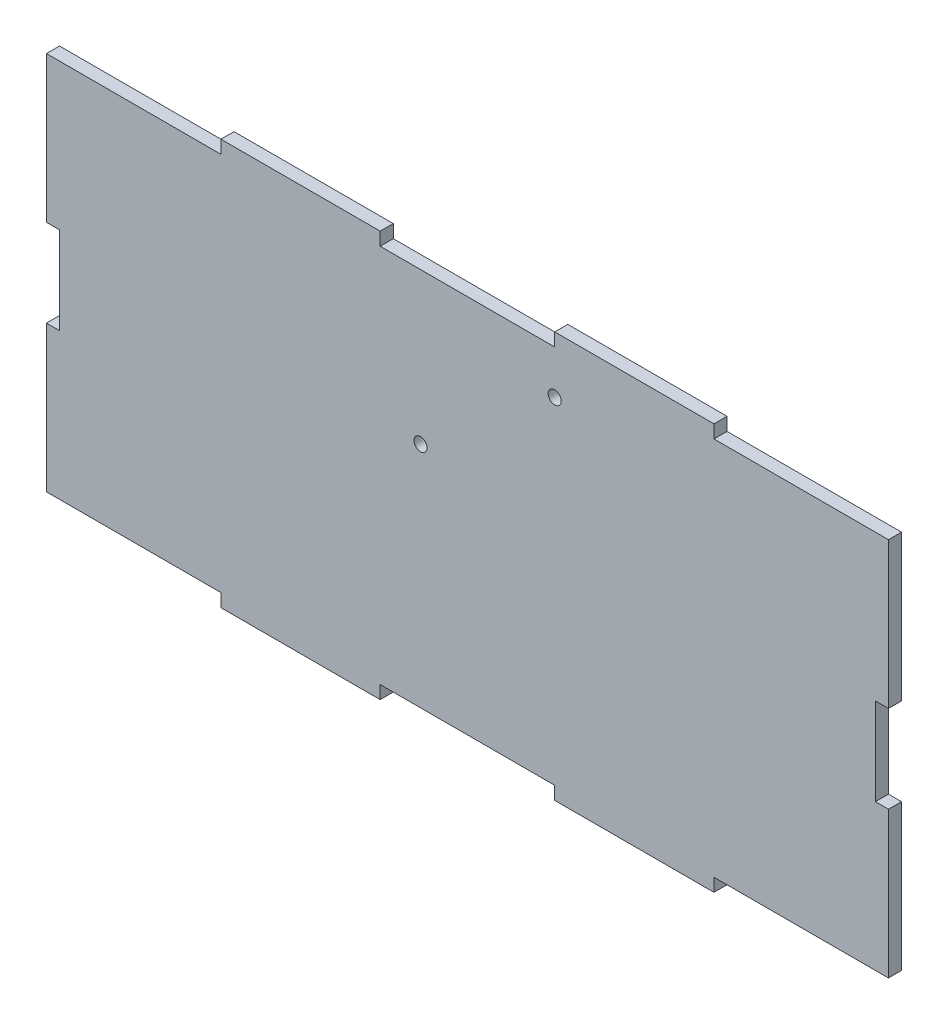
ISO-10303-21;
HEADER;
FILE_DESCRIPTION(('STEP AP214'),'2;1');
FILE_NAME('part.step','',(''),(''),'','','');
FILE_SCHEMA(('AUTOMOTIVE_DESIGN { 1 0 10303 214 1 1 1 1 }'));
ENDSEC;
DATA;
#1=APPLICATION_CONTEXT('core data for automotive mechanical design processes');
#2=APPLICATION_PROTOCOL_DEFINITION('international standard','automotive_design',2000,#1);
#3=PRODUCT_CONTEXT('',#1,'mechanical');
#4=PRODUCT('Part','Part','',(#3));
#5=PRODUCT_RELATED_PRODUCT_CATEGORY('part','',(#4));
#6=PRODUCT_DEFINITION_FORMATION('','',#4);
#7=PRODUCT_DEFINITION_CONTEXT('part definition',#1,'design');
#8=PRODUCT_DEFINITION('design','',#6,#7);
#9=PRODUCT_DEFINITION_SHAPE('','',#8);
#10=(LENGTH_UNIT() NAMED_UNIT(*) SI_UNIT(.MILLI.,.METRE.));
#11=(NAMED_UNIT(*) PLANE_ANGLE_UNIT() SI_UNIT($,.RADIAN.));
#12=(NAMED_UNIT(*) SI_UNIT($,.STERADIAN.) SOLID_ANGLE_UNIT());
#13=UNCERTAINTY_MEASURE_WITH_UNIT(LENGTH_MEASURE(1.E-05),#10,'distance_accuracy_value','');
#14=(GEOMETRIC_REPRESENTATION_CONTEXT(3) GLOBAL_UNCERTAINTY_ASSIGNED_CONTEXT((#13)) GLOBAL_UNIT_ASSIGNED_CONTEXT((#10,
#11,#12)) REPRESENTATION_CONTEXT('',''));
#15=CARTESIAN_POINT('',(0.,0.,0.));
#16=DIRECTION('',(0.,0.,1.));
#17=DIRECTION('',(1.,0.,0.));
#18=AXIS2_PLACEMENT_3D('',#15,#16,#17);
#19=CARTESIAN_POINT('',(96.5,46.5,3.));
#20=DIRECTION('',(-1.,0.,0.));
#21=DIRECTION('',(0.,-1.,0.));
#22=AXIS2_PLACEMENT_3D('',#19,#20,#21);
#23=PLANE('',#22);
#24=DIRECTION('',(0.,1.,0.));
#25=VECTOR('',#24,1.);
#26=CARTESIAN_POINT('',(96.5,46.5,0.));
#27=LINE('',#26,#25);
#28=CARTESIAN_POINT('',(96.5,-43.5,0.));
#29=VERTEX_POINT('',#28);
#30=CARTESIAN_POINT('',(96.5,-10.,0.));
#31=VERTEX_POINT('',#30);
#32=EDGE_CURVE('E257',#29,#31,#27,.T.);
#33=ORIENTED_EDGE('',*,*,#32,.T.);
#34=DIRECTION('',(0.,0.,-1.));
#35=VECTOR('',#34,1.);
#36=CARTESIAN_POINT('',(96.5,-10.,3.));
#37=LINE('',#36,#35);
#38=CARTESIAN_POINT('',(96.5,-10.,3.));
#39=VERTEX_POINT('',#38);
#40=EDGE_CURVE('E386',#39,#31,#37,.T.);
#41=ORIENTED_EDGE('',*,*,#40,.F.);
#42=DIRECTION('',(0.,1.,0.));
#43=VECTOR('',#42,1.);
#44=CARTESIAN_POINT('',(96.5,46.5,3.));
#45=LINE('',#44,#43);
#46=CARTESIAN_POINT('',(96.5,-43.5,3.));
#47=VERTEX_POINT('',#46);
#48=EDGE_CURVE('E368',#47,#39,#45,.T.);
#49=ORIENTED_EDGE('',*,*,#48,.F.);
#50=DIRECTION('',(0.,0.,-1.));
#51=VECTOR('',#50,1.);
#52=CARTESIAN_POINT('',(96.5,-43.5,3.));
#53=LINE('',#52,#51);
#54=EDGE_CURVE('E339',#47,#29,#53,.T.);
#55=ORIENTED_EDGE('',*,*,#54,.T.);
#56=EDGE_LOOP('',(#33,#41,#49,#55));
#57=FACE_BOUND('',#56,.T.);
#58=ADVANCED_FACE('F33',(#57),#23,.F.);
#59=CARTESIAN_POINT('',(-96.5,46.5,3.));
#60=DIRECTION('',(0.,-1.,0.));
#61=DIRECTION('',(0.,0.,-1.));
#62=AXIS2_PLACEMENT_3D('',#59,#60,#61);
#63=PLANE('',#62);
#64=DIRECTION('',(-1.,0.,0.));
#65=VECTOR('',#64,1.);
#66=CARTESIAN_POINT('',(-96.5,46.5,3.));
#67=LINE('',#66,#65);
#68=CARTESIAN_POINT('',(-20.,46.5,3.));
#69=VERTEX_POINT('',#68);
#70=CARTESIAN_POINT('',(-56.5,46.5,3.));
#71=VERTEX_POINT('',#70);
#72=EDGE_CURVE('E370',#69,#71,#67,.T.);
#73=ORIENTED_EDGE('',*,*,#72,.F.);
#74=DIRECTION('',(0.,0.,-1.));
#75=VECTOR('',#74,1.);
#76=CARTESIAN_POINT('',(-20.,46.5,3.));
#77=LINE('',#76,#75);
#78=CARTESIAN_POINT('',(-20.,46.5,0.));
#79=VERTEX_POINT('',#78);
#80=EDGE_CURVE('E306',#69,#79,#77,.T.);
#81=ORIENTED_EDGE('',*,*,#80,.T.);
#82=DIRECTION('',(-1.,0.,0.));
#83=VECTOR('',#82,1.);
#84=CARTESIAN_POINT('',(-96.5,46.5,0.));
#85=LINE('',#84,#83);
#86=CARTESIAN_POINT('',(-56.5,46.5,0.));
#87=VERTEX_POINT('',#86);
#88=EDGE_CURVE('E259',#79,#87,#85,.T.);
#89=ORIENTED_EDGE('',*,*,#88,.T.);
#90=DIRECTION('',(0.,0.,-1.));
#91=VECTOR('',#90,1.);
#92=CARTESIAN_POINT('',(-56.5,46.5,3.));
#93=LINE('',#92,#91);
#94=EDGE_CURVE('E58',#71,#87,#93,.T.);
#95=ORIENTED_EDGE('',*,*,#94,.F.);
#96=EDGE_LOOP('',(#73,#81,#89,#95));
#97=FACE_BOUND('',#96,.T.);
#98=ADVANCED_FACE('F457',(#97),#63,.F.);
#99=CARTESIAN_POINT('',(-96.5,46.5,3.));
#100=DIRECTION('',(1.,0.,0.));
#101=DIRECTION('',(0.,1.,0.));
#102=AXIS2_PLACEMENT_3D('',#99,#100,#101);
#103=PLANE('',#102);
#104=DIRECTION('',(0.,-1.,0.));
#105=VECTOR('',#104,1.);
#106=CARTESIAN_POINT('',(-96.5,46.5,3.));
#107=LINE('',#106,#105);
#108=CARTESIAN_POINT('',(-96.5,-10.,3.));
#109=VERTEX_POINT('',#108);
#110=CARTESIAN_POINT('',(-96.5,-43.5,3.));
#111=VERTEX_POINT('',#110);
#112=EDGE_CURVE('E250',#109,#111,#107,.T.);
#113=ORIENTED_EDGE('',*,*,#112,.F.);
#114=DIRECTION('',(0.,0.,-1.));
#115=VECTOR('',#114,1.);
#116=CARTESIAN_POINT('',(-96.5,-10.,3.));
#117=LINE('',#116,#115);
#118=CARTESIAN_POINT('',(-96.5,-10.,0.));
#119=VERTEX_POINT('',#118);
#120=EDGE_CURVE('E419',#109,#119,#117,.T.);
#121=ORIENTED_EDGE('',*,*,#120,.T.);
#122=DIRECTION('',(0.,-1.,0.));
#123=VECTOR('',#122,1.);
#124=CARTESIAN_POINT('',(-96.5,46.5,0.));
#125=LINE('',#124,#123);
#126=CARTESIAN_POINT('',(-96.5,-43.4999999999999,0.));
#127=VERTEX_POINT('',#126);
#128=EDGE_CURVE('E262',#119,#127,#125,.T.);
#129=ORIENTED_EDGE('',*,*,#128,.T.);
#130=DIRECTION('',(0.,0.,-1.));
#131=VECTOR('',#130,1.);
#132=CARTESIAN_POINT('',(-96.5,-43.5,3.));
#133=LINE('',#132,#131);
#134=EDGE_CURVE('E317',#111,#127,#133,.T.);
#135=ORIENTED_EDGE('',*,*,#134,.F.);
#136=EDGE_LOOP('',(#113,#121,#129,#135));
#137=FACE_BOUND('',#136,.T.);
#138=ADVANCED_FACE('F480',(#137),#103,.F.);
#139=CARTESIAN_POINT('',(-96.5,-46.5,3.));
#140=DIRECTION('',(0.,1.,0.));
#141=DIRECTION('',(0.,0.,1.));
#142=AXIS2_PLACEMENT_3D('',#139,#140,#141);
#143=PLANE('',#142);
#144=DIRECTION('',(1.,0.,0.));
#145=VECTOR('',#144,1.);
#146=CARTESIAN_POINT('',(-96.5,-46.5,0.));
#147=LINE('',#146,#145);
#148=CARTESIAN_POINT('',(20.,-46.5,0.));
#149=VERTEX_POINT('',#148);
#150=CARTESIAN_POINT('',(56.5,-46.5,0.));
#151=VERTEX_POINT('',#150);
#152=EDGE_CURVE('E37',#149,#151,#147,.T.);
#153=ORIENTED_EDGE('',*,*,#152,.T.);
#154=DIRECTION('',(0.,0.,-1.));
#155=VECTOR('',#154,1.);
#156=CARTESIAN_POINT('',(56.5,-46.5,3.));
#157=LINE('',#156,#155);
#158=CARTESIAN_POINT('',(56.5,-46.5,3.));
#159=VERTEX_POINT('',#158);
#160=EDGE_CURVE('E224',#159,#151,#157,.T.);
#161=ORIENTED_EDGE('',*,*,#160,.F.);
#162=DIRECTION('',(1.,0.,0.));
#163=VECTOR('',#162,1.);
#164=CARTESIAN_POINT('',(-96.5,-46.5,3.));
#165=LINE('',#164,#163);
#166=CARTESIAN_POINT('',(20.,-46.5,3.));
#167=VERTEX_POINT('',#166);
#168=EDGE_CURVE('E42',#167,#159,#165,.T.);
#169=ORIENTED_EDGE('',*,*,#168,.F.);
#170=DIRECTION('',(0.,0.,-1.));
#171=VECTOR('',#170,1.);
#172=CARTESIAN_POINT('',(20.,-46.5,3.));
#173=LINE('',#172,#171);
#174=EDGE_CURVE('E335',#167,#149,#173,.T.);
#175=ORIENTED_EDGE('',*,*,#174,.T.);
#176=EDGE_LOOP('',(#153,#161,#169,#175));
#177=FACE_BOUND('',#176,.T.);
#178=ADVANCED_FACE('F237',(#177),#143,.F.);
#179=CARTESIAN_POINT('',(96.5,10.,3.));
#180=VERTEX_POINT('',#179);
#181=CARTESIAN_POINT('',(96.5,43.5,3.));
#182=VERTEX_POINT('',#181);
#183=EDGE_CURVE('E366',#180,#182,#45,.T.);
#184=ORIENTED_EDGE('',*,*,#183,.F.);
#185=DIRECTION('',(0.,0.,-1.));
#186=VECTOR('',#185,1.);
#187=CARTESIAN_POINT('',(96.5,10.,3.));
#188=LINE('',#187,#186);
#189=CARTESIAN_POINT('',(96.5,10.,0.));
#190=VERTEX_POINT('',#189);
#191=EDGE_CURVE('E391',#180,#190,#188,.T.);
#192=ORIENTED_EDGE('',*,*,#191,.T.);
#193=CARTESIAN_POINT('',(96.5,43.5,0.));
#194=VERTEX_POINT('',#193);
#195=EDGE_CURVE('E254',#190,#194,#27,.T.);
#196=ORIENTED_EDGE('',*,*,#195,.T.);
#197=DIRECTION('',(0.,0.,-1.));
#198=VECTOR('',#197,1.);
#199=CARTESIAN_POINT('',(96.5,43.5,3.));
#200=LINE('',#199,#198);
#201=EDGE_CURVE('E356',#182,#194,#200,.T.);
#202=ORIENTED_EDGE('',*,*,#201,.F.);
#203=EDGE_LOOP('',(#184,#192,#196,#202));
#204=FACE_BOUND('',#203,.T.);
#205=ADVANCED_FACE('F35',(#204),#23,.F.);
#206=CARTESIAN_POINT('',(56.5,46.5,0.));
#207=VERTEX_POINT('',#206);
#208=CARTESIAN_POINT('',(20.,46.5,0.));
#209=VERTEX_POINT('',#208);
#210=EDGE_CURVE('E261',#207,#209,#85,.T.);
#211=ORIENTED_EDGE('',*,*,#210,.T.);
#212=DIRECTION('',(0.,0.,-1.));
#213=VECTOR('',#212,1.);
#214=CARTESIAN_POINT('',(20.,46.5,3.));
#215=LINE('',#214,#213);
#216=CARTESIAN_POINT('',(20.,46.5,3.));
#217=VERTEX_POINT('',#216);
#218=EDGE_CURVE('E277',#217,#209,#215,.T.);
#219=ORIENTED_EDGE('',*,*,#218,.F.);
#220=CARTESIAN_POINT('',(56.5,46.5,3.));
#221=VERTEX_POINT('',#220);
#222=EDGE_CURVE('E372',#221,#217,#67,.T.);
#223=ORIENTED_EDGE('',*,*,#222,.F.);
#224=DIRECTION('',(0.,0.,-1.));
#225=VECTOR('',#224,1.);
#226=CARTESIAN_POINT('',(56.5,46.5,3.));
#227=LINE('',#226,#225);
#228=EDGE_CURVE('E258',#221,#207,#227,.T.);
#229=ORIENTED_EDGE('',*,*,#228,.T.);
#230=EDGE_LOOP('',(#211,#219,#223,#229));
#231=FACE_BOUND('',#230,.T.);
#232=ADVANCED_FACE('F275',(#231),#63,.F.);
#233=CARTESIAN_POINT('',(-96.5,43.5,0.));
#234=VERTEX_POINT('',#233);
#235=CARTESIAN_POINT('',(-96.5,10.,0.));
#236=VERTEX_POINT('',#235);
#237=EDGE_CURVE('E264',#234,#236,#125,.T.);
#238=ORIENTED_EDGE('',*,*,#237,.T.);
#239=DIRECTION('',(0.,0.,-1.));
#240=VECTOR('',#239,1.);
#241=CARTESIAN_POINT('',(-96.5,10.,3.));
#242=LINE('',#241,#240);
#243=CARTESIAN_POINT('',(-96.5,10.,3.));
#244=VERTEX_POINT('',#243);
#245=EDGE_CURVE('E410',#244,#236,#242,.T.);
#246=ORIENTED_EDGE('',*,*,#245,.F.);
#247=CARTESIAN_POINT('',(-96.5,43.5,3.));
#248=VERTEX_POINT('',#247);
#249=EDGE_CURVE('E248',#248,#244,#107,.T.);
#250=ORIENTED_EDGE('',*,*,#249,.F.);
#251=DIRECTION('',(0.,0.,-1.));
#252=VECTOR('',#251,1.);
#253=CARTESIAN_POINT('',(-96.5,43.5,3.));
#254=LINE('',#253,#252);
#255=EDGE_CURVE('E360',#248,#234,#254,.T.);
#256=ORIENTED_EDGE('',*,*,#255,.T.);
#257=EDGE_LOOP('',(#238,#246,#250,#256));
#258=FACE_BOUND('',#257,.T.);
#259=ADVANCED_FACE('F467',(#258),#103,.F.);
#260=CARTESIAN_POINT('',(-56.5,-46.5,0.));
#261=VERTEX_POINT('',#260);
#262=CARTESIAN_POINT('',(-20.,-46.5,0.));
#263=VERTEX_POINT('',#262);
#264=EDGE_CURVE('E369',#261,#263,#147,.T.);
#265=ORIENTED_EDGE('',*,*,#264,.T.);
#266=DIRECTION('',(0.,0.,-1.));
#267=VECTOR('',#266,1.);
#268=CARTESIAN_POINT('',(-20.,-46.5,3.));
#269=LINE('',#268,#267);
#270=CARTESIAN_POINT('',(-20.,-46.5,3.));
#271=VERTEX_POINT('',#270);
#272=EDGE_CURVE('E347',#271,#263,#269,.T.);
#273=ORIENTED_EDGE('',*,*,#272,.F.);
#274=CARTESIAN_POINT('',(-56.5,-46.5,3.));
#275=VERTEX_POINT('',#274);
#276=EDGE_CURVE('E11',#275,#271,#165,.T.);
#277=ORIENTED_EDGE('',*,*,#276,.F.);
#278=DIRECTION('',(0.,0.,-1.));
#279=VECTOR('',#278,1.);
#280=CARTESIAN_POINT('',(-56.5,-46.5,3.));
#281=LINE('',#280,#279);
#282=EDGE_CURVE('E296',#275,#261,#281,.T.);
#283=ORIENTED_EDGE('',*,*,#282,.T.);
#284=EDGE_LOOP('',(#265,#273,#277,#283));
#285=FACE_BOUND('',#284,.T.);
#286=ADVANCED_FACE('F493',(#285),#143,.F.);
#287=CARTESIAN_POINT('',(0.,0.,3.));
#288=DIRECTION('',(0.,0.,1.));
#289=DIRECTION('',(1.,0.,0.));
#290=AXIS2_PLACEMENT_3D('',#287,#288,#289);
#291=PLANE('',#290);
#292=CARTESIAN_POINT('',(20.,33.5,3.));
#293=DIRECTION('',(0.,0.,-1.));
#294=DIRECTION('',(-1.,0.,0.));
#295=AXIS2_PLACEMENT_3D('',#292,#293,#294);
#296=CIRCLE('',#295,1.5);
#297=CARTESIAN_POINT('',(18.5,33.5,3.));
#298=VERTEX_POINT('',#297);
#299=EDGE_CURVE('E415',#298,#298,#296,.T.);
#300=ORIENTED_EDGE('',*,*,#299,.T.);
#301=EDGE_LOOP('',(#300));
#302=FACE_BOUND('',#301,.T.);
#303=DIRECTION('',(-1.,0.,0.));
#304=VECTOR('',#303,1.);
#305=CARTESIAN_POINT('',(-96.5,-10.,3.));
#306=LINE('',#305,#304);
#307=CARTESIAN_POINT('',(-93.5,-10.,3.));
#308=VERTEX_POINT('',#307);
#309=EDGE_CURVE('E408',#308,#109,#306,.T.);
#310=ORIENTED_EDGE('',*,*,#309,.T.);
#311=ORIENTED_EDGE('',*,*,#112,.T.);
#312=DIRECTION('',(1.,0.,0.));
#313=VECTOR('',#312,1.);
#314=CARTESIAN_POINT('',(-96.5,-43.5,3.));
#315=LINE('',#314,#313);
#316=CARTESIAN_POINT('',(-56.5,-43.5,3.));
#317=VERTEX_POINT('',#316);
#318=EDGE_CURVE('E310',#111,#317,#315,.T.);
#319=ORIENTED_EDGE('',*,*,#318,.T.);
#320=DIRECTION('',(0.,-1.,0.));
#321=VECTOR('',#320,1.);
#322=CARTESIAN_POINT('',(-56.5,-46.5,3.));
#323=LINE('',#322,#321);
#324=EDGE_CURVE('E313',#317,#275,#323,.T.);
#325=ORIENTED_EDGE('',*,*,#324,.T.);
#326=ORIENTED_EDGE('',*,*,#276,.T.);
#327=DIRECTION('',(0.,1.,0.));
#328=VECTOR('',#327,1.);
#329=CARTESIAN_POINT('',(-20.,-46.5,3.));
#330=LINE('',#329,#328);
#331=CARTESIAN_POINT('',(-20.,-43.5,3.));
#332=VERTEX_POINT('',#331);
#333=EDGE_CURVE('E329',#271,#332,#330,.T.);
#334=ORIENTED_EDGE('',*,*,#333,.T.);
#335=DIRECTION('',(1.,0.,0.));
#336=VECTOR('',#335,1.);
#337=CARTESIAN_POINT('',(20.,-43.5,3.));
#338=LINE('',#337,#336);
#339=CARTESIAN_POINT('',(20.,-43.5,3.));
#340=VERTEX_POINT('',#339);
#341=EDGE_CURVE('E333',#332,#340,#338,.T.);
#342=ORIENTED_EDGE('',*,*,#341,.T.);
#343=DIRECTION('',(0.,-1.,0.));
#344=VECTOR('',#343,1.);
#345=CARTESIAN_POINT('',(20.,-46.5,3.));
#346=LINE('',#345,#344);
#347=EDGE_CURVE('E247',#340,#167,#346,.T.);
#348=ORIENTED_EDGE('',*,*,#347,.T.);
#349=ORIENTED_EDGE('',*,*,#168,.T.);
#350=DIRECTION('',(0.,1.,0.));
#351=VECTOR('',#350,1.);
#352=CARTESIAN_POINT('',(56.5,-46.5,3.));
#353=LINE('',#352,#351);
#354=CARTESIAN_POINT('',(56.5,-43.5,3.));
#355=VERTEX_POINT('',#354);
#356=EDGE_CURVE('E220',#159,#355,#353,.T.);
#357=ORIENTED_EDGE('',*,*,#356,.T.);
#358=DIRECTION('',(1.,0.,0.));
#359=VECTOR('',#358,1.);
#360=CARTESIAN_POINT('',(96.5,-43.5,3.));
#361=LINE('',#360,#359);
#362=EDGE_CURVE('E231',#355,#47,#361,.T.);
#363=ORIENTED_EDGE('',*,*,#362,.T.);
#364=ORIENTED_EDGE('',*,*,#48,.T.);
#365=DIRECTION('',(-1.,0.,0.));
#366=VECTOR('',#365,1.);
#367=CARTESIAN_POINT('',(96.5,-10.,3.));
#368=LINE('',#367,#366);
#369=CARTESIAN_POINT('',(93.5,-10.,3.));
#370=VERTEX_POINT('',#369);
#371=EDGE_CURVE('E380',#39,#370,#368,.T.);
#372=ORIENTED_EDGE('',*,*,#371,.T.);
#373=DIRECTION('',(0.,1.,0.));
#374=VECTOR('',#373,1.);
#375=CARTESIAN_POINT('',(93.5,10.,3.));
#376=LINE('',#375,#374);
#377=CARTESIAN_POINT('',(93.5,10.,3.));
#378=VERTEX_POINT('',#377);
#379=EDGE_CURVE('E511',#370,#378,#376,.T.);
#380=ORIENTED_EDGE('',*,*,#379,.T.);
#381=DIRECTION('',(1.,0.,0.));
#382=VECTOR('',#381,1.);
#383=CARTESIAN_POINT('',(96.5,10.,3.));
#384=LINE('',#383,#382);
#385=EDGE_CURVE('E513',#378,#180,#384,.T.);
#386=ORIENTED_EDGE('',*,*,#385,.T.);
#387=ORIENTED_EDGE('',*,*,#183,.T.);
#388=DIRECTION('',(-1.,0.,0.));
#389=VECTOR('',#388,1.);
#390=CARTESIAN_POINT('',(96.5,43.5,3.));
#391=LINE('',#390,#389);
#392=CARTESIAN_POINT('',(56.5,43.5,3.));
#393=VERTEX_POINT('',#392);
#394=EDGE_CURVE('E350',#182,#393,#391,.T.);
#395=ORIENTED_EDGE('',*,*,#394,.T.);
#396=DIRECTION('',(0.,1.,0.));
#397=VECTOR('',#396,1.);
#398=CARTESIAN_POINT('',(56.5,46.5,3.));
#399=LINE('',#398,#397);
#400=EDGE_CURVE('E353',#393,#221,#399,.T.);
#401=ORIENTED_EDGE('',*,*,#400,.T.);
#402=ORIENTED_EDGE('',*,*,#222,.T.);
#403=DIRECTION('',(0.,-1.,0.));
#404=VECTOR('',#403,1.);
#405=CARTESIAN_POINT('',(20.,46.5,3.));
#406=LINE('',#405,#404);
#407=CARTESIAN_POINT('',(20.,43.5,3.));
#408=VERTEX_POINT('',#407);
#409=EDGE_CURVE('E446',#217,#408,#406,.T.);
#410=ORIENTED_EDGE('',*,*,#409,.T.);
#411=DIRECTION('',(-1.,0.,0.));
#412=VECTOR('',#411,1.);
#413=CARTESIAN_POINT('',(20.,43.5,3.));
#414=LINE('',#413,#412);
#415=CARTESIAN_POINT('',(-20.,43.5,3.));
#416=VERTEX_POINT('',#415);
#417=EDGE_CURVE('E309',#408,#416,#414,.T.);
#418=ORIENTED_EDGE('',*,*,#417,.T.);
#419=DIRECTION('',(0.,1.,0.));
#420=VECTOR('',#419,1.);
#421=CARTESIAN_POINT('',(-20.,46.5,3.));
#422=LINE('',#421,#420);
#423=EDGE_CURVE('E294',#416,#69,#422,.T.);
#424=ORIENTED_EDGE('',*,*,#423,.T.);
#425=ORIENTED_EDGE('',*,*,#72,.T.);
#426=DIRECTION('',(0.,-1.,0.));
#427=VECTOR('',#426,1.);
#428=CARTESIAN_POINT('',(-56.5,46.5,3.));
#429=LINE('',#428,#427);
#430=CARTESIAN_POINT('',(-56.5,43.5,3.));
#431=VERTEX_POINT('',#430);
#432=EDGE_CURVE('E432',#71,#431,#429,.T.);
#433=ORIENTED_EDGE('',*,*,#432,.T.);
#434=DIRECTION('',(-1.,0.,0.));
#435=VECTOR('',#434,1.);
#436=CARTESIAN_POINT('',(-96.5,43.5,3.));
#437=LINE('',#436,#435);
#438=EDGE_CURVE('E434',#431,#248,#437,.T.);
#439=ORIENTED_EDGE('',*,*,#438,.T.);
#440=ORIENTED_EDGE('',*,*,#249,.T.);
#441=DIRECTION('',(1.,0.,0.));
#442=VECTOR('',#441,1.);
#443=CARTESIAN_POINT('',(-96.5,10.,3.));
#444=LINE('',#443,#442);
#445=CARTESIAN_POINT('',(-93.5,10.,3.));
#446=VERTEX_POINT('',#445);
#447=EDGE_CURVE('E401',#244,#446,#444,.T.);
#448=ORIENTED_EDGE('',*,*,#447,.T.);
#449=DIRECTION('',(0.,-1.,0.));
#450=VECTOR('',#449,1.);
#451=CARTESIAN_POINT('',(-93.5,10.,3.));
#452=LINE('',#451,#450);
#453=EDGE_CURVE('E404',#446,#308,#452,.T.);
#454=ORIENTED_EDGE('',*,*,#453,.T.);
#455=EDGE_LOOP('',(#310,#311,#319,#325,#326,#334,#342,#348,#349,#357,#363,#364,#372,#380,#386,
#387,#395,#401,#402,#410,#418,#424,#425,#433,#439,#440,#448,#454));
#456=FACE_BOUND('',#455,.T.);
#457=CARTESIAN_POINT('',(-10.759,8.83699999999999,3.));
#458=DIRECTION('',(0.,0.,-1.));
#459=DIRECTION('',(-1.,0.,0.));
#460=AXIS2_PLACEMENT_3D('',#457,#458,#459);
#461=CIRCLE('',#460,1.5);
#462=CARTESIAN_POINT('',(-12.259,8.83699999999999,3.));
#463=VERTEX_POINT('',#462);
#464=EDGE_CURVE('E431',#463,#463,#461,.T.);
#465=ORIENTED_EDGE('',*,*,#464,.T.);
#466=EDGE_LOOP('',(#465));
#467=FACE_BOUND('',#466,.T.);
#468=ADVANCED_FACE('F243',(#302,#456,#467),#291,.T.);
#469=CARTESIAN_POINT('',(0.,0.,0.));
#470=DIRECTION('',(0.,0.,1.));
#471=DIRECTION('',(1.,0.,0.));
#472=AXIS2_PLACEMENT_3D('',#469,#470,#471);
#473=PLANE('',#472);
#474=CARTESIAN_POINT('',(20.,33.5,0.));
#475=DIRECTION('',(0.,0.,-1.));
#476=DIRECTION('',(-1.,0.,0.));
#477=AXIS2_PLACEMENT_3D('',#474,#475,#476);
#478=CIRCLE('',#477,1.5);
#479=CARTESIAN_POINT('',(18.5,33.5,0.));
#480=VERTEX_POINT('',#479);
#481=EDGE_CURVE('E428',#480,#480,#478,.T.);
#482=ORIENTED_EDGE('',*,*,#481,.F.);
#483=EDGE_LOOP('',(#482));
#484=FACE_BOUND('',#483,.T.);
#485=CARTESIAN_POINT('',(-10.759,8.83699999999999,0.));
#486=DIRECTION('',(0.,0.,-1.));
#487=DIRECTION('',(-1.,0.,0.));
#488=AXIS2_PLACEMENT_3D('',#485,#486,#487);
#489=CIRCLE('',#488,1.5);
#490=CARTESIAN_POINT('',(-12.259,8.83699999999999,0.));
#491=VERTEX_POINT('',#490);
#492=EDGE_CURVE('E771',#491,#491,#489,.T.);
#493=ORIENTED_EDGE('',*,*,#492,.F.);
#494=EDGE_LOOP('',(#493));
#495=FACE_BOUND('',#494,.T.);
#496=ORIENTED_EDGE('',*,*,#128,.F.);
#497=DIRECTION('',(-1.,0.,0.));
#498=VECTOR('',#497,1.);
#499=CARTESIAN_POINT('',(-96.5,-10.,0.));
#500=LINE('',#499,#498);
#501=CARTESIAN_POINT('',(-93.5,-10.,0.));
#502=VERTEX_POINT('',#501);
#503=EDGE_CURVE('E405',#502,#119,#500,.T.);
#504=ORIENTED_EDGE('',*,*,#503,.F.);
#505=DIRECTION('',(0.,-1.,0.));
#506=VECTOR('',#505,1.);
#507=CARTESIAN_POINT('',(-93.5,10.,0.));
#508=LINE('',#507,#506);
#509=CARTESIAN_POINT('',(-93.5,10.,0.));
#510=VERTEX_POINT('',#509);
#511=EDGE_CURVE('E414',#510,#502,#508,.T.);
#512=ORIENTED_EDGE('',*,*,#511,.F.);
#513=DIRECTION('',(1.,0.,0.));
#514=VECTOR('',#513,1.);
#515=CARTESIAN_POINT('',(-96.5,10.,0.));
#516=LINE('',#515,#514);
#517=EDGE_CURVE('E411',#236,#510,#516,.T.);
#518=ORIENTED_EDGE('',*,*,#517,.F.);
#519=ORIENTED_EDGE('',*,*,#237,.F.);
#520=DIRECTION('',(-1.,0.,0.));
#521=VECTOR('',#520,1.);
#522=CARTESIAN_POINT('',(-96.5,43.5,0.));
#523=LINE('',#522,#521);
#524=CARTESIAN_POINT('',(-56.5,43.5,0.));
#525=VERTEX_POINT('',#524);
#526=EDGE_CURVE('E435',#525,#234,#523,.T.);
#527=ORIENTED_EDGE('',*,*,#526,.F.);
#528=DIRECTION('',(0.,-1.,0.));
#529=VECTOR('',#528,1.);
#530=CARTESIAN_POINT('',(-56.5,46.5,0.));
#531=LINE('',#530,#529);
#532=EDGE_CURVE('E302',#87,#525,#531,.T.);
#533=ORIENTED_EDGE('',*,*,#532,.F.);
#534=ORIENTED_EDGE('',*,*,#88,.F.);
#535=DIRECTION('',(0.,1.,0.));
#536=VECTOR('',#535,1.);
#537=CARTESIAN_POINT('',(-20.,46.5,0.));
#538=LINE('',#537,#536);
#539=CARTESIAN_POINT('',(-20.,43.5,0.));
#540=VERTEX_POINT('',#539);
#541=EDGE_CURVE('E292',#540,#79,#538,.T.);
#542=ORIENTED_EDGE('',*,*,#541,.F.);
#543=DIRECTION('',(-1.,0.,0.));
#544=VECTOR('',#543,1.);
#545=CARTESIAN_POINT('',(20.,43.5,0.));
#546=LINE('',#545,#544);
#547=CARTESIAN_POINT('',(20.,43.5,0.));
#548=VERTEX_POINT('',#547);
#549=EDGE_CURVE('E290',#548,#540,#546,.T.);
#550=ORIENTED_EDGE('',*,*,#549,.F.);
#551=DIRECTION('',(0.,-1.,0.));
#552=VECTOR('',#551,1.);
#553=CARTESIAN_POINT('',(20.,46.5,0.));
#554=LINE('',#553,#552);
#555=EDGE_CURVE('E287',#209,#548,#554,.T.);
#556=ORIENTED_EDGE('',*,*,#555,.F.);
#557=ORIENTED_EDGE('',*,*,#210,.F.);
#558=DIRECTION('',(0.,1.,0.));
#559=VECTOR('',#558,1.);
#560=CARTESIAN_POINT('',(56.5,46.5,0.));
#561=LINE('',#560,#559);
#562=CARTESIAN_POINT('',(56.5,43.5,0.));
#563=VERTEX_POINT('',#562);
#564=EDGE_CURVE('E284',#563,#207,#561,.T.);
#565=ORIENTED_EDGE('',*,*,#564,.F.);
#566=DIRECTION('',(-1.,0.,0.));
#567=VECTOR('',#566,1.);
#568=CARTESIAN_POINT('',(96.5,43.5,0.));
#569=LINE('',#568,#567);
#570=EDGE_CURVE('E357',#194,#563,#569,.T.);
#571=ORIENTED_EDGE('',*,*,#570,.F.);
#572=ORIENTED_EDGE('',*,*,#195,.F.);
#573=DIRECTION('',(1.,0.,0.));
#574=VECTOR('',#573,1.);
#575=CARTESIAN_POINT('',(96.5,10.,0.));
#576=LINE('',#575,#574);
#577=CARTESIAN_POINT('',(93.5,10.,0.));
#578=VERTEX_POINT('',#577);
#579=EDGE_CURVE('E519',#578,#190,#576,.T.);
#580=ORIENTED_EDGE('',*,*,#579,.F.);
#581=DIRECTION('',(0.,1.,0.));
#582=VECTOR('',#581,1.);
#583=CARTESIAN_POINT('',(93.5,10.,0.));
#584=LINE('',#583,#582);
#585=CARTESIAN_POINT('',(93.5,-10.,0.));
#586=VERTEX_POINT('',#585);
#587=EDGE_CURVE('E50',#586,#578,#584,.T.);
#588=ORIENTED_EDGE('',*,*,#587,.F.);
#589=DIRECTION('',(-1.,0.,0.));
#590=VECTOR('',#589,1.);
#591=CARTESIAN_POINT('',(96.5,-10.,0.));
#592=LINE('',#591,#590);
#593=EDGE_CURVE('E514',#31,#586,#592,.T.);
#594=ORIENTED_EDGE('',*,*,#593,.F.);
#595=ORIENTED_EDGE('',*,*,#32,.F.);
#596=DIRECTION('',(1.,0.,0.));
#597=VECTOR('',#596,1.);
#598=CARTESIAN_POINT('',(96.5,-43.5,0.));
#599=LINE('',#598,#597);
#600=CARTESIAN_POINT('',(56.5,-43.5,0.));
#601=VERTEX_POINT('',#600);
#602=EDGE_CURVE('E232',#601,#29,#599,.T.);
#603=ORIENTED_EDGE('',*,*,#602,.F.);
#604=DIRECTION('',(0.,1.,0.));
#605=VECTOR('',#604,1.);
#606=CARTESIAN_POINT('',(56.5,-46.5,0.));
#607=LINE('',#606,#605);
#608=EDGE_CURVE('E393',#151,#601,#607,.T.);
#609=ORIENTED_EDGE('',*,*,#608,.F.);
#610=ORIENTED_EDGE('',*,*,#152,.F.);
#611=DIRECTION('',(0.,-1.,0.));
#612=VECTOR('',#611,1.);
#613=CARTESIAN_POINT('',(20.,-46.5,0.));
#614=LINE('',#613,#612);
#615=CARTESIAN_POINT('',(20.,-43.5,0.));
#616=VERTEX_POINT('',#615);
#617=EDGE_CURVE('E336',#616,#149,#614,.T.);
#618=ORIENTED_EDGE('',*,*,#617,.F.);
#619=DIRECTION('',(1.,0.,0.));
#620=VECTOR('',#619,1.);
#621=CARTESIAN_POINT('',(20.,-43.5,0.));
#622=LINE('',#621,#620);
#623=CARTESIAN_POINT('',(-20.,-43.5,0.));
#624=VERTEX_POINT('',#623);
#625=EDGE_CURVE('E330',#624,#616,#622,.T.);
#626=ORIENTED_EDGE('',*,*,#625,.F.);
#627=DIRECTION('',(0.,1.,0.));
#628=VECTOR('',#627,1.);
#629=CARTESIAN_POINT('',(-20.,-46.5,0.));
#630=LINE('',#629,#628);
#631=EDGE_CURVE('E338',#263,#624,#630,.T.);
#632=ORIENTED_EDGE('',*,*,#631,.F.);
#633=ORIENTED_EDGE('',*,*,#264,.F.);
#634=DIRECTION('',(0.,-1.,0.));
#635=VECTOR('',#634,1.);
#636=CARTESIAN_POINT('',(-56.5,-46.5,0.));
#637=LINE('',#636,#635);
#638=CARTESIAN_POINT('',(-56.5,-43.5,0.));
#639=VERTEX_POINT('',#638);
#640=EDGE_CURVE('E314',#639,#261,#637,.T.);
#641=ORIENTED_EDGE('',*,*,#640,.F.);
#642=DIRECTION('',(1.,0.,0.));
#643=VECTOR('',#642,1.);
#644=CARTESIAN_POINT('',(-96.5,-43.5,0.));
#645=LINE('',#644,#643);
#646=EDGE_CURVE('E318',#127,#639,#645,.T.);
#647=ORIENTED_EDGE('',*,*,#646,.F.);
#648=EDGE_LOOP('',(#496,#504,#512,#518,#519,#527,#533,#534,#542,#550,#556,#557,#565,#571,#572,
#580,#588,#594,#595,#603,#609,#610,#618,#626,#632,#633,#641,#647));
#649=FACE_BOUND('',#648,.T.);
#650=ADVANCED_FACE('F282',(#484,#495,#649),#473,.F.);
#651=CARTESIAN_POINT('',(56.5,46.5,3.));
#652=DIRECTION('',(-1.,0.,0.));
#653=DIRECTION('',(0.,0.,1.));
#654=AXIS2_PLACEMENT_3D('',#651,#652,#653);
#655=PLANE('',#654);
#656=ORIENTED_EDGE('',*,*,#564,.T.);
#657=ORIENTED_EDGE('',*,*,#228,.F.);
#658=ORIENTED_EDGE('',*,*,#400,.F.);
#659=DIRECTION('',(0.,0.,-1.));
#660=VECTOR('',#659,1.);
#661=CARTESIAN_POINT('',(56.5,43.5,3.));
#662=LINE('',#661,#660);
#663=EDGE_CURVE('E363',#393,#563,#662,.T.);
#664=ORIENTED_EDGE('',*,*,#663,.T.);
#665=EDGE_LOOP('',(#656,#657,#658,#664));
#666=FACE_BOUND('',#665,.T.);
#667=ADVANCED_FACE('F600',(#666),#655,.F.);
#668=CARTESIAN_POINT('',(96.5,43.5,3.));
#669=DIRECTION('',(0.,-1.,0.));
#670=DIRECTION('',(0.,0.,-1.));
#671=AXIS2_PLACEMENT_3D('',#668,#669,#670);
#672=PLANE('',#671);
#673=ORIENTED_EDGE('',*,*,#570,.T.);
#674=ORIENTED_EDGE('',*,*,#663,.F.);
#675=ORIENTED_EDGE('',*,*,#394,.F.);
#676=ORIENTED_EDGE('',*,*,#201,.T.);
#677=EDGE_LOOP('',(#673,#674,#675,#676));
#678=FACE_BOUND('',#677,.T.);
#679=ADVANCED_FACE('F606',(#678),#672,.F.);
#680=CARTESIAN_POINT('',(-10.759,8.83699999999999,3.));
#681=DIRECTION('',(0.,0.,-1.));
#682=DIRECTION('',(-1.,0.,0.));
#683=AXIS2_PLACEMENT_3D('',#680,#681,#682);
#684=CYLINDRICAL_SURFACE('',#683,1.5);
#685=ORIENTED_EDGE('',*,*,#464,.F.);
#686=EDGE_LOOP('',(#685));
#687=FACE_BOUND('',#686,.T.);
#688=ORIENTED_EDGE('',*,*,#492,.T.);
#689=EDGE_LOOP('',(#688));
#690=FACE_BOUND('',#689,.T.);
#691=ADVANCED_FACE('F616',(#687,#690),#684,.F.);
#692=CARTESIAN_POINT('',(-96.5,43.5,3.));
#693=DIRECTION('',(0.,-1.,0.));
#694=DIRECTION('',(1.,0.,0.));
#695=AXIS2_PLACEMENT_3D('',#692,#693,#694);
#696=PLANE('',#695);
#697=ORIENTED_EDGE('',*,*,#526,.T.);
#698=ORIENTED_EDGE('',*,*,#255,.F.);
#699=ORIENTED_EDGE('',*,*,#438,.F.);
#700=DIRECTION('',(0.,0.,-1.));
#701=VECTOR('',#700,1.);
#702=CARTESIAN_POINT('',(-56.5,43.5,3.));
#703=LINE('',#702,#701);
#704=EDGE_CURVE('E442',#431,#525,#703,.T.);
#705=ORIENTED_EDGE('',*,*,#704,.T.);
#706=EDGE_LOOP('',(#697,#698,#699,#705));
#707=FACE_BOUND('',#706,.T.);
#708=ADVANCED_FACE('F463',(#707),#696,.F.);
#709=CARTESIAN_POINT('',(-56.5,46.5,3.));
#710=DIRECTION('',(1.,0.,0.));
#711=DIRECTION('',(0.,0.,-1.));
#712=AXIS2_PLACEMENT_3D('',#709,#710,#711);
#713=PLANE('',#712);
#714=ORIENTED_EDGE('',*,*,#532,.T.);
#715=ORIENTED_EDGE('',*,*,#704,.F.);
#716=ORIENTED_EDGE('',*,*,#432,.F.);
#717=ORIENTED_EDGE('',*,*,#94,.T.);
#718=EDGE_LOOP('',(#714,#715,#716,#717));
#719=FACE_BOUND('',#718,.T.);
#720=ADVANCED_FACE('F460',(#719),#713,.F.);
#721=CARTESIAN_POINT('',(-20.,46.5,3.));
#722=DIRECTION('',(-1.,0.,0.));
#723=DIRECTION('',(0.,0.,1.));
#724=AXIS2_PLACEMENT_3D('',#721,#722,#723);
#725=PLANE('',#724);
#726=ORIENTED_EDGE('',*,*,#541,.T.);
#727=ORIENTED_EDGE('',*,*,#80,.F.);
#728=ORIENTED_EDGE('',*,*,#423,.F.);
#729=DIRECTION('',(0.,0.,-1.));
#730=VECTOR('',#729,1.);
#731=CARTESIAN_POINT('',(-20.,43.5,3.));
#732=LINE('',#731,#730);
#733=EDGE_CURVE('E300',#416,#540,#732,.T.);
#734=ORIENTED_EDGE('',*,*,#733,.T.);
#735=EDGE_LOOP('',(#726,#727,#728,#734));
#736=FACE_BOUND('',#735,.T.);
#737=ADVANCED_FACE('F454',(#736),#725,.F.);
#738=CARTESIAN_POINT('',(20.,43.5,3.));
#739=DIRECTION('',(0.,-1.,0.));
#740=DIRECTION('',(0.,0.,-1.));
#741=AXIS2_PLACEMENT_3D('',#738,#739,#740);
#742=PLANE('',#741);
#743=ORIENTED_EDGE('',*,*,#549,.T.);
#744=ORIENTED_EDGE('',*,*,#733,.F.);
#745=ORIENTED_EDGE('',*,*,#417,.F.);
#746=DIRECTION('',(0.,0.,-1.));
#747=VECTOR('',#746,1.);
#748=CARTESIAN_POINT('',(20.,43.5,3.));
#749=LINE('',#748,#747);
#750=EDGE_CURVE('E303',#408,#548,#749,.T.);
#751=ORIENTED_EDGE('',*,*,#750,.T.);
#752=EDGE_LOOP('',(#743,#744,#745,#751));
#753=FACE_BOUND('',#752,.T.);
#754=ADVANCED_FACE('F452',(#753),#742,.F.);
#755=CARTESIAN_POINT('',(20.,46.5,3.));
#756=DIRECTION('',(1.,0.,0.));
#757=DIRECTION('',(0.,0.,-1.));
#758=AXIS2_PLACEMENT_3D('',#755,#756,#757);
#759=PLANE('',#758);
#760=ORIENTED_EDGE('',*,*,#555,.T.);
#761=ORIENTED_EDGE('',*,*,#750,.F.);
#762=ORIENTED_EDGE('',*,*,#409,.F.);
#763=ORIENTED_EDGE('',*,*,#218,.T.);
#764=EDGE_LOOP('',(#760,#761,#762,#763));
#765=FACE_BOUND('',#764,.T.);
#766=ADVANCED_FACE('F654',(#765),#759,.F.);
#767=CARTESIAN_POINT('',(-56.5,-46.5,3.));
#768=DIRECTION('',(1.,0.,0.));
#769=DIRECTION('',(0.,0.,-1.));
#770=AXIS2_PLACEMENT_3D('',#767,#768,#769);
#771=PLANE('',#770);
#772=ORIENTED_EDGE('',*,*,#640,.T.);
#773=ORIENTED_EDGE('',*,*,#282,.F.);
#774=ORIENTED_EDGE('',*,*,#324,.F.);
#775=DIRECTION('',(0.,0.,-1.));
#776=VECTOR('',#775,1.);
#777=CARTESIAN_POINT('',(-56.5,-43.5,3.));
#778=LINE('',#777,#776);
#779=EDGE_CURVE('E325',#317,#639,#778,.T.);
#780=ORIENTED_EDGE('',*,*,#779,.T.);
#781=EDGE_LOOP('',(#772,#773,#774,#780));
#782=FACE_BOUND('',#781,.T.);
#783=ADVANCED_FACE('F489',(#782),#771,.F.);
#784=CARTESIAN_POINT('',(-96.5,-43.5,3.));
#785=DIRECTION('',(0.,1.,0.));
#786=DIRECTION('',(-1.,0.,0.));
#787=AXIS2_PLACEMENT_3D('',#784,#785,#786);
#788=PLANE('',#787);
#789=ORIENTED_EDGE('',*,*,#646,.T.);
#790=ORIENTED_EDGE('',*,*,#779,.F.);
#791=ORIENTED_EDGE('',*,*,#318,.F.);
#792=ORIENTED_EDGE('',*,*,#134,.T.);
#793=EDGE_LOOP('',(#789,#790,#791,#792));
#794=FACE_BOUND('',#793,.T.);
#795=ADVANCED_FACE('F483',(#794),#788,.F.);
#796=CARTESIAN_POINT('',(20.,-46.5,3.));
#797=DIRECTION('',(1.,0.,0.));
#798=DIRECTION('',(0.,0.,-1.));
#799=AXIS2_PLACEMENT_3D('',#796,#797,#798);
#800=PLANE('',#799);
#801=ORIENTED_EDGE('',*,*,#617,.T.);
#802=ORIENTED_EDGE('',*,*,#174,.F.);
#803=ORIENTED_EDGE('',*,*,#347,.F.);
#804=DIRECTION('',(0.,0.,-1.));
#805=VECTOR('',#804,1.);
#806=CARTESIAN_POINT('',(20.,-43.5,3.));
#807=LINE('',#806,#805);
#808=EDGE_CURVE('E321',#340,#616,#807,.T.);
#809=ORIENTED_EDGE('',*,*,#808,.T.);
#810=EDGE_LOOP('',(#801,#802,#803,#809));
#811=FACE_BOUND('',#810,.T.);
#812=ADVANCED_FACE('F503',(#811),#800,.F.);
#813=CARTESIAN_POINT('',(20.,-43.5,3.));
#814=DIRECTION('',(0.,1.,0.));
#815=DIRECTION('',(0.,0.,1.));
#816=AXIS2_PLACEMENT_3D('',#813,#814,#815);
#817=PLANE('',#816);
#818=ORIENTED_EDGE('',*,*,#625,.T.);
#819=ORIENTED_EDGE('',*,*,#808,.F.);
#820=ORIENTED_EDGE('',*,*,#341,.F.);
#821=DIRECTION('',(0.,0.,-1.));
#822=VECTOR('',#821,1.);
#823=CARTESIAN_POINT('',(-20.,-43.5,3.));
#824=LINE('',#823,#822);
#825=EDGE_CURVE('E345',#332,#624,#824,.T.);
#826=ORIENTED_EDGE('',*,*,#825,.T.);
#827=EDGE_LOOP('',(#818,#819,#820,#826));
#828=FACE_BOUND('',#827,.T.);
#829=ADVANCED_FACE('F500',(#828),#817,.F.);
#830=CARTESIAN_POINT('',(-20.,-46.5,3.));
#831=DIRECTION('',(-1.,0.,0.));
#832=DIRECTION('',(0.,0.,1.));
#833=AXIS2_PLACEMENT_3D('',#830,#831,#832);
#834=PLANE('',#833);
#835=ORIENTED_EDGE('',*,*,#631,.T.);
#836=ORIENTED_EDGE('',*,*,#825,.F.);
#837=ORIENTED_EDGE('',*,*,#333,.F.);
#838=ORIENTED_EDGE('',*,*,#272,.T.);
#839=EDGE_LOOP('',(#835,#836,#837,#838));
#840=FACE_BOUND('',#839,.T.);
#841=ADVANCED_FACE('F497',(#840),#834,.F.);
#842=CARTESIAN_POINT('',(96.5,-43.5,3.));
#843=DIRECTION('',(0.,1.,0.));
#844=DIRECTION('',(-1.,0.,0.));
#845=AXIS2_PLACEMENT_3D('',#842,#843,#844);
#846=PLANE('',#845);
#847=ORIENTED_EDGE('',*,*,#602,.T.);
#848=ORIENTED_EDGE('',*,*,#54,.F.);
#849=ORIENTED_EDGE('',*,*,#362,.F.);
#850=DIRECTION('',(0.,0.,-1.));
#851=VECTOR('',#850,1.);
#852=CARTESIAN_POINT('',(56.5,-43.5,3.));
#853=LINE('',#852,#851);
#854=EDGE_CURVE('E226',#355,#601,#853,.T.);
#855=ORIENTED_EDGE('',*,*,#854,.T.);
#856=EDGE_LOOP('',(#847,#848,#849,#855));
#857=FACE_BOUND('',#856,.T.);
#858=ADVANCED_FACE('F538',(#857),#846,.F.);
#859=CARTESIAN_POINT('',(56.5,-46.5,3.));
#860=DIRECTION('',(-1.,0.,0.));
#861=DIRECTION('',(0.,0.,1.));
#862=AXIS2_PLACEMENT_3D('',#859,#860,#861);
#863=PLANE('',#862);
#864=ORIENTED_EDGE('',*,*,#608,.T.);
#865=ORIENTED_EDGE('',*,*,#854,.F.);
#866=ORIENTED_EDGE('',*,*,#356,.F.);
#867=ORIENTED_EDGE('',*,*,#160,.T.);
#868=EDGE_LOOP('',(#864,#865,#866,#867));
#869=FACE_BOUND('',#868,.T.);
#870=ADVANCED_FACE('F223',(#869),#863,.F.);
#871=CARTESIAN_POINT('',(93.5,10.,3.));
#872=DIRECTION('',(-1.,0.,0.));
#873=DIRECTION('',(0.,0.,1.));
#874=AXIS2_PLACEMENT_3D('',#871,#872,#873);
#875=PLANE('',#874);
#876=ORIENTED_EDGE('',*,*,#587,.T.);
#877=DIRECTION('',(0.,0.,-1.));
#878=VECTOR('',#877,1.);
#879=CARTESIAN_POINT('',(93.5,10.,3.));
#880=LINE('',#879,#878);
#881=EDGE_CURVE('E396',#378,#578,#880,.T.);
#882=ORIENTED_EDGE('',*,*,#881,.F.);
#883=ORIENTED_EDGE('',*,*,#379,.F.);
#884=DIRECTION('',(0.,0.,-1.));
#885=VECTOR('',#884,1.);
#886=CARTESIAN_POINT('',(93.5,-10.,3.));
#887=LINE('',#886,#885);
#888=EDGE_CURVE('E390',#370,#586,#887,.T.);
#889=ORIENTED_EDGE('',*,*,#888,.T.);
#890=EDGE_LOOP('',(#876,#882,#883,#889));
#891=FACE_BOUND('',#890,.T.);
#892=ADVANCED_FACE('F530',(#891),#875,.F.);
#893=CARTESIAN_POINT('',(96.5,-10.,3.));
#894=DIRECTION('',(0.,-1.,0.));
#895=DIRECTION('',(0.,0.,-1.));
#896=AXIS2_PLACEMENT_3D('',#893,#894,#895);
#897=PLANE('',#896);
#898=ORIENTED_EDGE('',*,*,#593,.T.);
#899=ORIENTED_EDGE('',*,*,#888,.F.);
#900=ORIENTED_EDGE('',*,*,#371,.F.);
#901=ORIENTED_EDGE('',*,*,#40,.T.);
#902=EDGE_LOOP('',(#898,#899,#900,#901));
#903=FACE_BOUND('',#902,.T.);
#904=ADVANCED_FACE('F520',(#903),#897,.F.);
#905=CARTESIAN_POINT('',(96.5,10.,3.));
#906=DIRECTION('',(0.,1.,0.));
#907=DIRECTION('',(0.,0.,1.));
#908=AXIS2_PLACEMENT_3D('',#905,#906,#907);
#909=PLANE('',#908);
#910=ORIENTED_EDGE('',*,*,#579,.T.);
#911=ORIENTED_EDGE('',*,*,#191,.F.);
#912=ORIENTED_EDGE('',*,*,#385,.F.);
#913=ORIENTED_EDGE('',*,*,#881,.T.);
#914=EDGE_LOOP('',(#910,#911,#912,#913));
#915=FACE_BOUND('',#914,.T.);
#916=ADVANCED_FACE('F525',(#915),#909,.F.);
#917=CARTESIAN_POINT('',(-96.5,-10.,3.));
#918=DIRECTION('',(0.,-1.,0.));
#919=DIRECTION('',(0.,0.,-1.));
#920=AXIS2_PLACEMENT_3D('',#917,#918,#919);
#921=PLANE('',#920);
#922=ORIENTED_EDGE('',*,*,#503,.T.);
#923=ORIENTED_EDGE('',*,*,#120,.F.);
#924=ORIENTED_EDGE('',*,*,#309,.F.);
#925=DIRECTION('',(0.,0.,-1.));
#926=VECTOR('',#925,1.);
#927=CARTESIAN_POINT('',(-93.5,-10.,3.));
#928=LINE('',#927,#926);
#929=EDGE_CURVE('E421',#308,#502,#928,.T.);
#930=ORIENTED_EDGE('',*,*,#929,.T.);
#931=EDGE_LOOP('',(#922,#923,#924,#930));
#932=FACE_BOUND('',#931,.T.);
#933=ADVANCED_FACE('F726',(#932),#921,.F.);
#934=CARTESIAN_POINT('',(-93.5,10.,3.));
#935=DIRECTION('',(1.,0.,0.));
#936=DIRECTION('',(0.,1.,0.));
#937=AXIS2_PLACEMENT_3D('',#934,#935,#936);
#938=PLANE('',#937);
#939=ORIENTED_EDGE('',*,*,#511,.T.);
#940=ORIENTED_EDGE('',*,*,#929,.F.);
#941=ORIENTED_EDGE('',*,*,#453,.F.);
#942=DIRECTION('',(0.,0.,-1.));
#943=VECTOR('',#942,1.);
#944=CARTESIAN_POINT('',(-93.5,10.,3.));
#945=LINE('',#944,#943);
#946=EDGE_CURVE('E423',#446,#510,#945,.T.);
#947=ORIENTED_EDGE('',*,*,#946,.T.);
#948=EDGE_LOOP('',(#939,#940,#941,#947));
#949=FACE_BOUND('',#948,.T.);
#950=ADVANCED_FACE('F474',(#949),#938,.F.);
#951=CARTESIAN_POINT('',(-96.5,10.,3.));
#952=DIRECTION('',(0.,1.,0.));
#953=DIRECTION('',(0.,0.,1.));
#954=AXIS2_PLACEMENT_3D('',#951,#952,#953);
#955=PLANE('',#954);
#956=ORIENTED_EDGE('',*,*,#517,.T.);
#957=ORIENTED_EDGE('',*,*,#946,.F.);
#958=ORIENTED_EDGE('',*,*,#447,.F.);
#959=ORIENTED_EDGE('',*,*,#245,.T.);
#960=EDGE_LOOP('',(#956,#957,#958,#959));
#961=FACE_BOUND('',#960,.T.);
#962=ADVANCED_FACE('F470',(#961),#955,.F.);
#963=CARTESIAN_POINT('',(20.,33.5,3.));
#964=DIRECTION('',(0.,0.,-1.));
#965=DIRECTION('',(-1.,0.,0.));
#966=AXIS2_PLACEMENT_3D('',#963,#964,#965);
#967=CYLINDRICAL_SURFACE('',#966,1.5);
#968=ORIENTED_EDGE('',*,*,#299,.F.);
#969=EDGE_LOOP('',(#968));
#970=FACE_BOUND('',#969,.T.);
#971=ORIENTED_EDGE('',*,*,#481,.T.);
#972=EDGE_LOOP('',(#971));
#973=FACE_BOUND('',#972,.T.);
#974=ADVANCED_FACE('F746',(#970,#973),#967,.F.);
#975=CLOSED_SHELL('',(#58,#98,#138,#178,#205,#232,#259,#286,#468,#650,#667,#679,#691,#708,#720,
#737,#754,#766,#783,#795,#812,#829,#841,#858,#870,#892,#904,#916,#933,#950,#962,#974));
#976=MANIFOLD_SOLID_BREP('B2',#975);
#977=ADVANCED_BREP_SHAPE_REPRESENTATION('',(#18,#976),#14);
#978=SHAPE_DEFINITION_REPRESENTATION(#9,#977);
ENDSEC;
END-ISO-10303-21;
